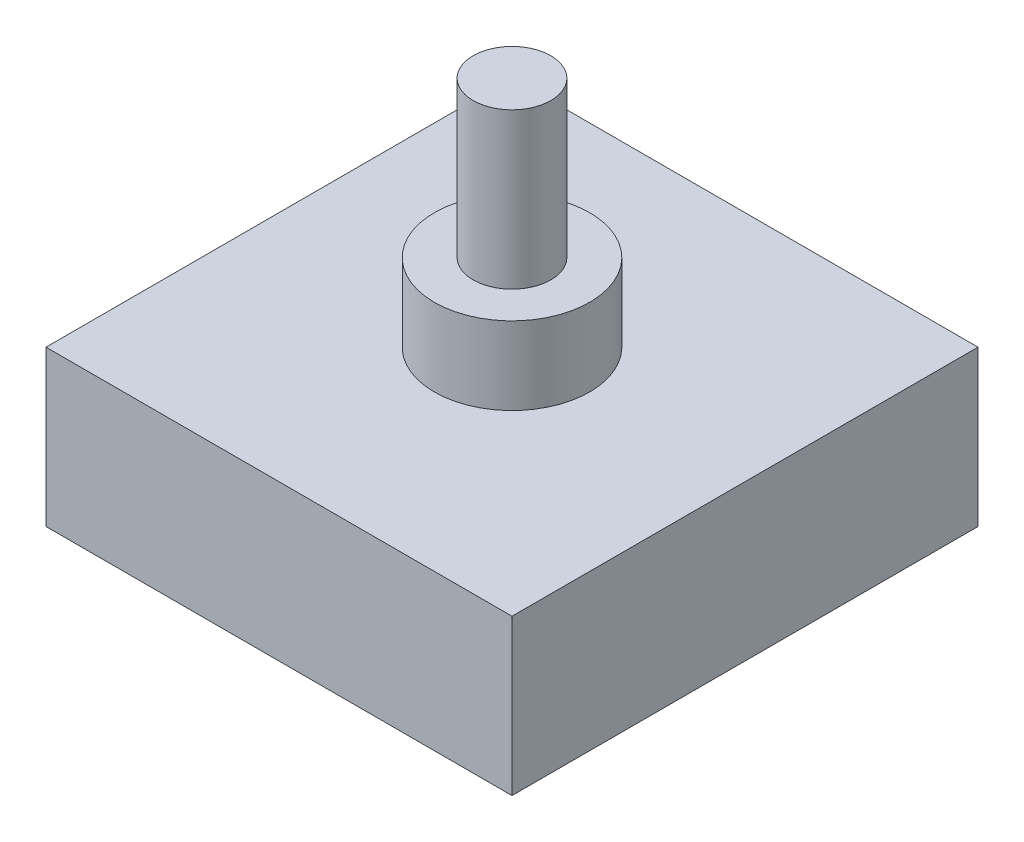
ISO-10303-21;
HEADER;
FILE_DESCRIPTION(('STEP AP214'),'2;1');
FILE_NAME('part.step','',(''),(''),'','','');
FILE_SCHEMA(('AUTOMOTIVE_DESIGN { 1 0 10303 214 1 1 1 1 }'));
ENDSEC;
DATA;
#1=APPLICATION_CONTEXT('core data for automotive mechanical design processes');
#2=APPLICATION_PROTOCOL_DEFINITION('international standard','automotive_design',2000,#1);
#3=PRODUCT_CONTEXT('',#1,'mechanical');
#4=PRODUCT('Part','Part','',(#3));
#5=PRODUCT_RELATED_PRODUCT_CATEGORY('part','',(#4));
#6=PRODUCT_DEFINITION_FORMATION('','',#4);
#7=PRODUCT_DEFINITION_CONTEXT('part definition',#1,'design');
#8=PRODUCT_DEFINITION('design','',#6,#7);
#9=PRODUCT_DEFINITION_SHAPE('','',#8);
#10=(LENGTH_UNIT() NAMED_UNIT(*) SI_UNIT(.MILLI.,.METRE.));
#11=(NAMED_UNIT(*) PLANE_ANGLE_UNIT() SI_UNIT($,.RADIAN.));
#12=(NAMED_UNIT(*) SI_UNIT($,.STERADIAN.) SOLID_ANGLE_UNIT());
#13=UNCERTAINTY_MEASURE_WITH_UNIT(LENGTH_MEASURE(1.E-05),#10,'distance_accuracy_value','');
#14=(GEOMETRIC_REPRESENTATION_CONTEXT(3) GLOBAL_UNCERTAINTY_ASSIGNED_CONTEXT((#13)) GLOBAL_UNIT_ASSIGNED_CONTEXT((#10,
#11,#12)) REPRESENTATION_CONTEXT('',''));
#15=CARTESIAN_POINT('',(0.,0.,0.));
#16=DIRECTION('',(0.,0.,1.));
#17=DIRECTION('',(1.,0.,0.));
#18=AXIS2_PLACEMENT_3D('',#15,#16,#17);
#19=CARTESIAN_POINT('',(0.,25.4,-177.8));
#20=DIRECTION('',(1.,0.,0.));
#21=DIRECTION('',(0.,0.,-1.));
#22=AXIS2_PLACEMENT_3D('',#19,#20,#21);
#23=PLANE('',#22);
#24=DIRECTION('',(0.,0.,1.));
#25=VECTOR('',#24,1.);
#26=CARTESIAN_POINT('',(0.,0.,-177.8));
#27=LINE('',#26,#25);
#28=CARTESIAN_POINT('',(0.,0.,-177.8));
#29=VERTEX_POINT('',#28);
#30=CARTESIAN_POINT('',(0.,0.,-101.6));
#31=VERTEX_POINT('',#30);
#32=EDGE_CURVE('E100',#29,#31,#27,.T.);
#33=ORIENTED_EDGE('',*,*,#32,.T.);
#34=DIRECTION('',(0.,-1.,0.));
#35=VECTOR('',#34,1.);
#36=CARTESIAN_POINT('',(0.,25.4,-101.6));
#37=LINE('',#36,#35);
#38=CARTESIAN_POINT('',(0.,25.4,-101.6));
#39=VERTEX_POINT('',#38);
#40=EDGE_CURVE('E36',#39,#31,#37,.T.);
#41=ORIENTED_EDGE('',*,*,#40,.F.);
#42=DIRECTION('',(0.,0.,1.));
#43=VECTOR('',#42,1.);
#44=CARTESIAN_POINT('',(0.,25.4,-177.8));
#45=LINE('',#44,#43);
#46=CARTESIAN_POINT('',(0.,25.4,-177.8));
#47=VERTEX_POINT('',#46);
#48=EDGE_CURVE('E85',#47,#39,#45,.T.);
#49=ORIENTED_EDGE('',*,*,#48,.F.);
#50=DIRECTION('',(0.,-1.,0.));
#51=VECTOR('',#50,1.);
#52=CARTESIAN_POINT('',(0.,25.4,-177.8));
#53=LINE('',#52,#51);
#54=EDGE_CURVE('E51',#47,#29,#53,.T.);
#55=ORIENTED_EDGE('',*,*,#54,.T.);
#56=EDGE_LOOP('',(#33,#41,#49,#55));
#57=FACE_BOUND('',#56,.T.);
#58=ADVANCED_FACE('F33',(#57),#23,.F.);
#59=CARTESIAN_POINT('',(0.,25.4,-101.6));
#60=DIRECTION('',(0.,0.,-1.));
#61=DIRECTION('',(-1.,0.,0.));
#62=AXIS2_PLACEMENT_3D('',#59,#60,#61);
#63=PLANE('',#62);
#64=DIRECTION('',(1.,0.,0.));
#65=VECTOR('',#64,1.);
#66=CARTESIAN_POINT('',(0.,0.,-101.6));
#67=LINE('',#66,#65);
#68=CARTESIAN_POINT('',(76.2,0.,-101.6));
#69=VERTEX_POINT('',#68);
#70=EDGE_CURVE('E91',#31,#69,#67,.T.);
#71=ORIENTED_EDGE('',*,*,#70,.T.);
#72=DIRECTION('',(0.,-1.,0.));
#73=VECTOR('',#72,1.);
#74=CARTESIAN_POINT('',(76.2,25.4,-101.6));
#75=LINE('',#74,#73);
#76=CARTESIAN_POINT('',(76.2,25.4,-101.6));
#77=VERTEX_POINT('',#76);
#78=EDGE_CURVE('E89',#77,#69,#75,.T.);
#79=ORIENTED_EDGE('',*,*,#78,.F.);
#80=DIRECTION('',(1.,0.,0.));
#81=VECTOR('',#80,1.);
#82=CARTESIAN_POINT('',(0.,25.4,-101.6));
#83=LINE('',#82,#81);
#84=EDGE_CURVE('E77',#39,#77,#83,.T.);
#85=ORIENTED_EDGE('',*,*,#84,.F.);
#86=ORIENTED_EDGE('',*,*,#40,.T.);
#87=EDGE_LOOP('',(#71,#79,#85,#86));
#88=FACE_BOUND('',#87,.T.);
#89=ADVANCED_FACE('F90',(#88),#63,.F.);
#90=CARTESIAN_POINT('',(76.2,25.4,-177.8));
#91=DIRECTION('',(1.,0.,0.));
#92=DIRECTION('',(0.,0.,-1.));
#93=AXIS2_PLACEMENT_3D('',#90,#91,#92);
#94=PLANE('',#93);
#95=DIRECTION('',(0.,0.,1.));
#96=VECTOR('',#95,1.);
#97=CARTESIAN_POINT('',(76.2,0.,-177.8));
#98=LINE('',#97,#96);
#99=CARTESIAN_POINT('',(76.2,0.,-177.8));
#100=VERTEX_POINT('',#99);
#101=EDGE_CURVE('E104',#100,#69,#98,.T.);
#102=ORIENTED_EDGE('',*,*,#101,.F.);
#103=DIRECTION('',(0.,-1.,0.));
#104=VECTOR('',#103,1.);
#105=CARTESIAN_POINT('',(76.2,25.4,-177.8));
#106=LINE('',#105,#104);
#107=CARTESIAN_POINT('',(76.2,25.4,-177.8));
#108=VERTEX_POINT('',#107);
#109=EDGE_CURVE('E65',#108,#100,#106,.T.);
#110=ORIENTED_EDGE('',*,*,#109,.F.);
#111=DIRECTION('',(0.,0.,1.));
#112=VECTOR('',#111,1.);
#113=CARTESIAN_POINT('',(76.2,25.4,-177.8));
#114=LINE('',#113,#112);
#115=EDGE_CURVE('E84',#108,#77,#114,.T.);
#116=ORIENTED_EDGE('',*,*,#115,.T.);
#117=ORIENTED_EDGE('',*,*,#78,.T.);
#118=EDGE_LOOP('',(#102,#110,#116,#117));
#119=FACE_BOUND('',#118,.T.);
#120=ADVANCED_FACE('F94',(#119),#94,.T.);
#121=CARTESIAN_POINT('',(0.,25.4,-177.8));
#122=DIRECTION('',(0.,0.,-1.));
#123=DIRECTION('',(-1.,0.,0.));
#124=AXIS2_PLACEMENT_3D('',#121,#122,#123);
#125=PLANE('',#124);
#126=DIRECTION('',(1.,0.,0.));
#127=VECTOR('',#126,1.);
#128=CARTESIAN_POINT('',(0.,0.,-177.8));
#129=LINE('',#128,#127);
#130=EDGE_CURVE('E106',#29,#100,#129,.T.);
#131=ORIENTED_EDGE('',*,*,#130,.F.);
#132=ORIENTED_EDGE('',*,*,#54,.F.);
#133=DIRECTION('',(1.,0.,0.));
#134=VECTOR('',#133,1.);
#135=CARTESIAN_POINT('',(0.,25.4,-177.8));
#136=LINE('',#135,#134);
#137=EDGE_CURVE('E95',#47,#108,#136,.T.);
#138=ORIENTED_EDGE('',*,*,#137,.T.);
#139=ORIENTED_EDGE('',*,*,#109,.T.);
#140=EDGE_LOOP('',(#131,#132,#138,#139));
#141=FACE_BOUND('',#140,.T.);
#142=ADVANCED_FACE('F142',(#141),#125,.T.);
#143=CARTESIAN_POINT('',(0.,25.4,0.));
#144=DIRECTION('',(0.,1.,0.));
#145=DIRECTION('',(0.,0.,1.));
#146=AXIS2_PLACEMENT_3D('',#143,#144,#145);
#147=PLANE('',#146);
#148=CARTESIAN_POINT('',(38.1,25.4,-139.7));
#149=DIRECTION('',(0.,1.,0.));
#150=DIRECTION('',(0.,0.,1.));
#151=AXIS2_PLACEMENT_3D('',#148,#149,#150);
#152=CIRCLE('',#151,12.7);
#153=CARTESIAN_POINT('',(38.1,25.4,-127.));
#154=VERTEX_POINT('',#153);
#155=EDGE_CURVE('E42',#154,#154,#152,.T.);
#156=ORIENTED_EDGE('',*,*,#155,.F.);
#157=EDGE_LOOP('',(#156));
#158=FACE_BOUND('',#157,.T.);
#159=ORIENTED_EDGE('',*,*,#48,.T.);
#160=ORIENTED_EDGE('',*,*,#84,.T.);
#161=ORIENTED_EDGE('',*,*,#115,.F.);
#162=ORIENTED_EDGE('',*,*,#137,.F.);
#163=EDGE_LOOP('',(#159,#160,#161,#162));
#164=FACE_BOUND('',#163,.T.);
#165=ADVANCED_FACE('F81',(#158,#164),#147,.T.);
#166=CARTESIAN_POINT('',(0.,0.,0.));
#167=DIRECTION('',(0.,1.,0.));
#168=DIRECTION('',(0.,0.,1.));
#169=AXIS2_PLACEMENT_3D('',#166,#167,#168);
#170=PLANE('',#169);
#171=ORIENTED_EDGE('',*,*,#32,.F.);
#172=ORIENTED_EDGE('',*,*,#130,.T.);
#173=ORIENTED_EDGE('',*,*,#101,.T.);
#174=ORIENTED_EDGE('',*,*,#70,.F.);
#175=EDGE_LOOP('',(#171,#172,#173,#174));
#176=FACE_BOUND('',#175,.T.);
#177=ADVANCED_FACE('F137',(#176),#170,.F.);
#178=CARTESIAN_POINT('',(38.1,38.1,-139.7));
#179=DIRECTION('',(0.,-1.,0.));
#180=DIRECTION('',(0.,0.,-1.));
#181=AXIS2_PLACEMENT_3D('',#178,#179,#180);
#182=CYLINDRICAL_SURFACE('',#181,12.7);
#183=CARTESIAN_POINT('',(38.1,38.1,-139.7));
#184=DIRECTION('',(0.,1.,0.));
#185=DIRECTION('',(0.,0.,1.));
#186=AXIS2_PLACEMENT_3D('',#183,#184,#185);
#187=CIRCLE('',#186,12.7);
#188=CARTESIAN_POINT('',(38.1,38.1,-127.));
#189=VERTEX_POINT('',#188);
#190=EDGE_CURVE('E102',#189,#189,#187,.T.);
#191=ORIENTED_EDGE('',*,*,#190,.F.);
#192=EDGE_LOOP('',(#191));
#193=FACE_BOUND('',#192,.T.);
#194=ORIENTED_EDGE('',*,*,#155,.T.);
#195=EDGE_LOOP('',(#194));
#196=FACE_BOUND('',#195,.T.);
#197=ADVANCED_FACE('F131',(#193,#196),#182,.T.);
#198=CARTESIAN_POINT('',(38.1,38.1,-139.7));
#199=DIRECTION('',(0.,1.,0.));
#200=DIRECTION('',(0.,0.,1.));
#201=AXIS2_PLACEMENT_3D('',#198,#199,#200);
#202=PLANE('',#201);
#203=CARTESIAN_POINT('',(38.1,38.1,-139.7));
#204=DIRECTION('',(0.,1.,0.));
#205=DIRECTION('',(0.,0.,1.));
#206=AXIS2_PLACEMENT_3D('',#203,#204,#205);
#207=CIRCLE('',#206,6.35);
#208=CARTESIAN_POINT('',(38.1,38.1,-133.35));
#209=VERTEX_POINT('',#208);
#210=EDGE_CURVE('E11',#209,#209,#207,.T.);
#211=ORIENTED_EDGE('',*,*,#210,.F.);
#212=EDGE_LOOP('',(#211));
#213=FACE_BOUND('',#212,.T.);
#214=ORIENTED_EDGE('',*,*,#190,.T.);
#215=EDGE_LOOP('',(#214));
#216=FACE_BOUND('',#215,.T.);
#217=ADVANCED_FACE('F125',(#213,#216),#202,.T.);
#218=CARTESIAN_POINT('',(38.1,63.5,-139.7));
#219=DIRECTION('',(0.,-1.,0.));
#220=DIRECTION('',(0.,0.,-1.));
#221=AXIS2_PLACEMENT_3D('',#218,#219,#220);
#222=CYLINDRICAL_SURFACE('',#221,6.35);
#223=CARTESIAN_POINT('',(38.1,63.5,-139.7));
#224=DIRECTION('',(0.,1.,0.));
#225=DIRECTION('',(0.,0.,1.));
#226=AXIS2_PLACEMENT_3D('',#223,#224,#225);
#227=CIRCLE('',#226,6.35);
#228=CARTESIAN_POINT('',(38.1,63.5,-133.35));
#229=VERTEX_POINT('',#228);
#230=EDGE_CURVE('E115',#229,#229,#227,.T.);
#231=ORIENTED_EDGE('',*,*,#230,.F.);
#232=EDGE_LOOP('',(#231));
#233=FACE_BOUND('',#232,.T.);
#234=ORIENTED_EDGE('',*,*,#210,.T.);
#235=EDGE_LOOP('',(#234));
#236=FACE_BOUND('',#235,.T.);
#237=ADVANCED_FACE('F122',(#233,#236),#222,.T.);
#238=CARTESIAN_POINT('',(38.1,63.5,-139.7));
#239=DIRECTION('',(0.,1.,0.));
#240=DIRECTION('',(0.,0.,1.));
#241=AXIS2_PLACEMENT_3D('',#238,#239,#240);
#242=PLANE('',#241);
#243=ORIENTED_EDGE('',*,*,#230,.T.);
#244=EDGE_LOOP('',(#243));
#245=FACE_BOUND('',#244,.T.);
#246=ADVANCED_FACE('F120',(#245),#242,.T.);
#247=CLOSED_SHELL('',(#58,#89,#120,#142,#165,#177,#197,#217,#237,#246));
#248=MANIFOLD_SOLID_BREP('B2',#247);
#249=ADVANCED_BREP_SHAPE_REPRESENTATION('',(#18,#248),#14);
#250=SHAPE_DEFINITION_REPRESENTATION(#9,#249);
ENDSEC;
END-ISO-10303-21;
